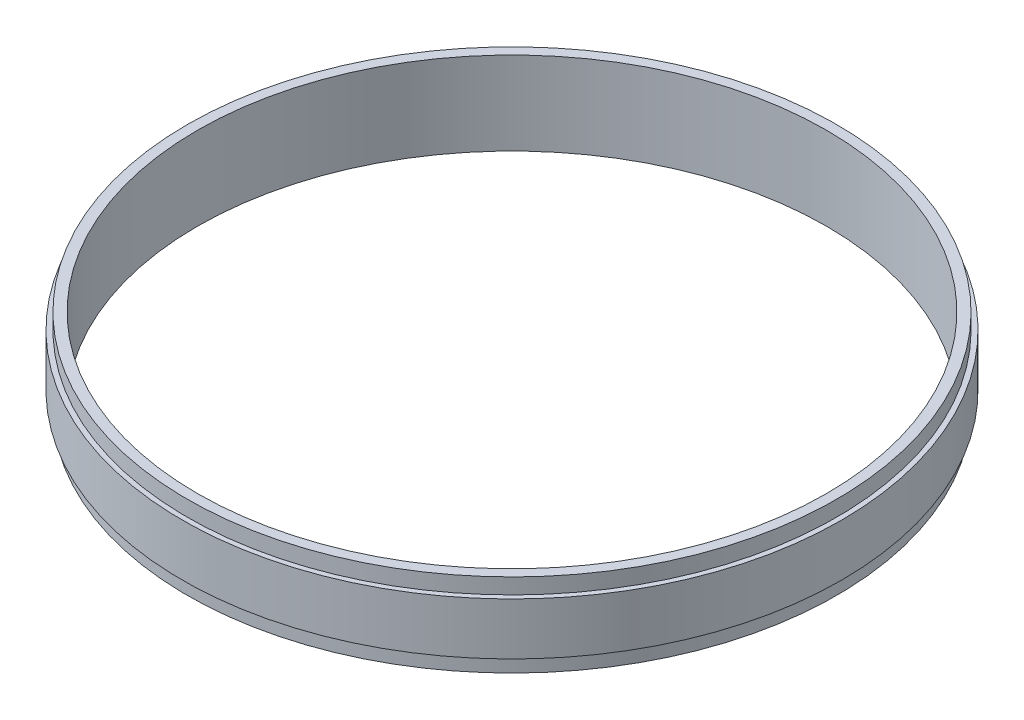
ISO-10303-21;
HEADER;
FILE_DESCRIPTION(('STEP AP214'),'2;1');
FILE_NAME('part.step','',(''),(''),'','','');
FILE_SCHEMA(('AUTOMOTIVE_DESIGN { 1 0 10303 214 1 1 1 1 }'));
ENDSEC;
DATA;
#1=APPLICATION_CONTEXT('core data for automotive mechanical design processes');
#2=APPLICATION_PROTOCOL_DEFINITION('international standard','automotive_design',2000,#1);
#3=PRODUCT_CONTEXT('',#1,'mechanical');
#4=PRODUCT('Part','Part','',(#3));
#5=PRODUCT_RELATED_PRODUCT_CATEGORY('part','',(#4));
#6=PRODUCT_DEFINITION_FORMATION('','',#4);
#7=PRODUCT_DEFINITION_CONTEXT('part definition',#1,'design');
#8=PRODUCT_DEFINITION('design','',#6,#7);
#9=PRODUCT_DEFINITION_SHAPE('','',#8);
#10=(LENGTH_UNIT() NAMED_UNIT(*) SI_UNIT(.MILLI.,.METRE.));
#11=(NAMED_UNIT(*) PLANE_ANGLE_UNIT() SI_UNIT($,.RADIAN.));
#12=(NAMED_UNIT(*) SI_UNIT($,.STERADIAN.) SOLID_ANGLE_UNIT());
#13=UNCERTAINTY_MEASURE_WITH_UNIT(LENGTH_MEASURE(1.E-05),#10,'distance_accuracy_value','');
#14=(GEOMETRIC_REPRESENTATION_CONTEXT(3) GLOBAL_UNCERTAINTY_ASSIGNED_CONTEXT((#13)) GLOBAL_UNIT_ASSIGNED_CONTEXT((#10,
#11,#12)) REPRESENTATION_CONTEXT('',''));
#15=CARTESIAN_POINT('',(0.,0.,0.));
#16=DIRECTION('',(0.,0.,1.));
#17=DIRECTION('',(1.,0.,0.));
#18=AXIS2_PLACEMENT_3D('',#15,#16,#17);
#19=CARTESIAN_POINT('',(0.,-0.8,0.));
#20=DIRECTION('',(0.,1.,0.));
#21=DIRECTION('',(1.,0.,0.));
#22=AXIS2_PLACEMENT_3D('',#19,#20,#21);
#23=CYLINDRICAL_SURFACE('',#22,62.475);
#24=CARTESIAN_POINT('',(0.,3.,0.));
#25=DIRECTION('',(0.,1.,0.));
#26=DIRECTION('',(1.,0.,0.));
#27=AXIS2_PLACEMENT_3D('',#24,#25,#26);
#28=CIRCLE('',#27,62.475);
#29=CARTESIAN_POINT('',(-62.475,3.,0.));
#30=VERTEX_POINT('',#29);
#31=EDGE_CURVE('E21',#30,#30,#28,.T.);
#32=ORIENTED_EDGE('',*,*,#31,.F.);
#33=DIRECTION('',(0.,-1.,0.));
#34=VECTOR('',#33,1.);
#35=CARTESIAN_POINT('',(-62.475,-0.8,0.));
#36=LINE('',#35,#34);
#37=CARTESIAN_POINT('',(-62.475,0.,0.));
#38=VERTEX_POINT('',#37);
#39=EDGE_CURVE('E11',#30,#38,#36,.T.);
#40=ORIENTED_EDGE('',*,*,#39,.T.);
#41=CARTESIAN_POINT('',(0.,0.,0.));
#42=DIRECTION('',(0.,-1.,0.));
#43=DIRECTION('',(1.,0.,0.));
#44=AXIS2_PLACEMENT_3D('',#41,#42,#43);
#45=CIRCLE('',#44,62.475);
#46=EDGE_CURVE('E85',#38,#38,#45,.T.);
#47=ORIENTED_EDGE('',*,*,#46,.F.);
#48=ORIENTED_EDGE('',*,*,#39,.F.);
#49=EDGE_LOOP('',(#32,#40,#47,#48));
#50=FACE_BOUND('',#49,.T.);
#51=ADVANCED_FACE('F17',(#50),#23,.T.);
#52=CARTESIAN_POINT('',(0.,3.,0.));
#53=DIRECTION('',(0.,1.,0.));
#54=DIRECTION('',(1.,0.,0.));
#55=AXIS2_PLACEMENT_3D('',#52,#53,#54);
#56=PLANE('',#55);
#57=ORIENTED_EDGE('',*,*,#31,.T.);
#58=EDGE_LOOP('',(#57));
#59=FACE_BOUND('',#58,.T.);
#60=CARTESIAN_POINT('',(0.,3.,0.));
#61=DIRECTION('',(0.,1.,0.));
#62=DIRECTION('',(1.,0.,0.));
#63=AXIS2_PLACEMENT_3D('',#60,#61,#62);
#64=CIRCLE('',#63,63.4);
#65=CARTESIAN_POINT('',(-63.4,3.,0.));
#66=VERTEX_POINT('',#65);
#67=EDGE_CURVE('E86',#66,#66,#64,.T.);
#68=ORIENTED_EDGE('',*,*,#67,.F.);
#69=EDGE_LOOP('',(#68));
#70=FACE_BOUND('',#69,.T.);
#71=ADVANCED_FACE('F136',(#59,#70),#56,.F.);
#72=CARTESIAN_POINT('',(0.,-0.8,0.));
#73=DIRECTION('',(0.,1.,0.));
#74=DIRECTION('',(1.,0.,0.));
#75=AXIS2_PLACEMENT_3D('',#72,#73,#74);
#76=CYLINDRICAL_SURFACE('',#75,63.4);
#77=CARTESIAN_POINT('',(0.,13.,0.));
#78=DIRECTION('',(0.,1.,0.));
#79=DIRECTION('',(1.,0.,0.));
#80=AXIS2_PLACEMENT_3D('',#77,#78,#79);
#81=CIRCLE('',#80,63.4);
#82=CARTESIAN_POINT('',(-63.4,13.,0.));
#83=VERTEX_POINT('',#82);
#84=EDGE_CURVE('E98',#83,#83,#81,.T.);
#85=ORIENTED_EDGE('',*,*,#84,.F.);
#86=DIRECTION('',(0.,-1.,0.));
#87=VECTOR('',#86,1.);
#88=CARTESIAN_POINT('',(-63.4,-0.8,0.));
#89=LINE('',#88,#87);
#90=EDGE_CURVE('E88',#83,#66,#89,.T.);
#91=ORIENTED_EDGE('',*,*,#90,.T.);
#92=ORIENTED_EDGE('',*,*,#67,.T.);
#93=ORIENTED_EDGE('',*,*,#90,.F.);
#94=EDGE_LOOP('',(#85,#91,#92,#93));
#95=FACE_BOUND('',#94,.T.);
#96=ADVANCED_FACE('F116',(#95),#76,.T.);
#97=CARTESIAN_POINT('',(0.,13.,0.));
#98=DIRECTION('',(0.,1.,0.));
#99=DIRECTION('',(1.,0.,0.));
#100=AXIS2_PLACEMENT_3D('',#97,#98,#99);
#101=PLANE('',#100);
#102=CARTESIAN_POINT('',(0.,13.,0.));
#103=DIRECTION('',(0.,1.,0.));
#104=DIRECTION('',(1.,0.,0.));
#105=AXIS2_PLACEMENT_3D('',#102,#103,#104);
#106=CIRCLE('',#105,62.45);
#107=CARTESIAN_POINT('',(-62.45,13.,0.));
#108=VERTEX_POINT('',#107);
#109=EDGE_CURVE('E95',#108,#108,#106,.T.);
#110=ORIENTED_EDGE('',*,*,#109,.F.);
#111=EDGE_LOOP('',(#110));
#112=FACE_BOUND('',#111,.T.);
#113=ORIENTED_EDGE('',*,*,#84,.T.);
#114=EDGE_LOOP('',(#113));
#115=FACE_BOUND('',#114,.T.);
#116=ADVANCED_FACE('F149',(#112,#115),#101,.T.);
#117=CARTESIAN_POINT('',(0.,-0.8,0.));
#118=DIRECTION('',(0.,1.,0.));
#119=DIRECTION('',(1.,0.,0.));
#120=AXIS2_PLACEMENT_3D('',#117,#118,#119);
#121=CYLINDRICAL_SURFACE('',#120,62.45);
#122=CARTESIAN_POINT('',(0.,16.,0.));
#123=DIRECTION('',(0.,1.,0.));
#124=DIRECTION('',(1.,0.,0.));
#125=AXIS2_PLACEMENT_3D('',#122,#123,#124);
#126=CIRCLE('',#125,62.45);
#127=CARTESIAN_POINT('',(-62.45,16.,0.));
#128=VERTEX_POINT('',#127);
#129=EDGE_CURVE('E69',#128,#128,#126,.T.);
#130=ORIENTED_EDGE('',*,*,#129,.F.);
#131=DIRECTION('',(0.,-1.,0.));
#132=VECTOR('',#131,1.);
#133=CARTESIAN_POINT('',(-62.45,-0.8,0.));
#134=LINE('',#133,#132);
#135=EDGE_CURVE('E77',#128,#108,#134,.T.);
#136=ORIENTED_EDGE('',*,*,#135,.T.);
#137=ORIENTED_EDGE('',*,*,#109,.T.);
#138=ORIENTED_EDGE('',*,*,#135,.F.);
#139=EDGE_LOOP('',(#130,#136,#137,#138));
#140=FACE_BOUND('',#139,.T.);
#141=ADVANCED_FACE('F167',(#140),#121,.T.);
#142=CARTESIAN_POINT('',(0.,16.,0.));
#143=DIRECTION('',(0.,1.,0.));
#144=DIRECTION('',(1.,0.,0.));
#145=AXIS2_PLACEMENT_3D('',#142,#143,#144);
#146=PLANE('',#145);
#147=CARTESIAN_POINT('',(0.,16.,0.));
#148=DIRECTION('',(0.,1.,0.));
#149=DIRECTION('',(1.,0.,0.));
#150=AXIS2_PLACEMENT_3D('',#147,#148,#149);
#151=CIRCLE('',#150,60.525);
#152=CARTESIAN_POINT('',(-60.525,16.,0.));
#153=VERTEX_POINT('',#152);
#154=EDGE_CURVE('E66',#153,#153,#151,.T.);
#155=ORIENTED_EDGE('',*,*,#154,.F.);
#156=EDGE_LOOP('',(#155));
#157=FACE_BOUND('',#156,.T.);
#158=ORIENTED_EDGE('',*,*,#129,.T.);
#159=EDGE_LOOP('',(#158));
#160=FACE_BOUND('',#159,.T.);
#161=ADVANCED_FACE('F131',(#157,#160),#146,.T.);
#162=CARTESIAN_POINT('',(0.,-0.8,0.));
#163=DIRECTION('',(0.,1.,0.));
#164=DIRECTION('',(1.,0.,0.));
#165=AXIS2_PLACEMENT_3D('',#162,#163,#164);
#166=CYLINDRICAL_SURFACE('',#165,60.525);
#167=CARTESIAN_POINT('',(0.,0.,0.));
#168=DIRECTION('',(0.,1.,0.));
#169=DIRECTION('',(1.,0.,0.));
#170=AXIS2_PLACEMENT_3D('',#167,#168,#169);
#171=CIRCLE('',#170,60.525);
#172=CARTESIAN_POINT('',(-60.525,0.,0.));
#173=VERTEX_POINT('',#172);
#174=EDGE_CURVE('E79',#173,#173,#171,.T.);
#175=ORIENTED_EDGE('',*,*,#174,.F.);
#176=DIRECTION('',(0.,1.,0.));
#177=VECTOR('',#176,1.);
#178=CARTESIAN_POINT('',(-60.525,-0.8,0.));
#179=LINE('',#178,#177);
#180=EDGE_CURVE('E61',#173,#153,#179,.T.);
#181=ORIENTED_EDGE('',*,*,#180,.T.);
#182=ORIENTED_EDGE('',*,*,#154,.T.);
#183=ORIENTED_EDGE('',*,*,#180,.F.);
#184=EDGE_LOOP('',(#175,#181,#182,#183));
#185=FACE_BOUND('',#184,.T.);
#186=ADVANCED_FACE('F19',(#185),#166,.F.);
#187=CARTESIAN_POINT('',(0.,0.,0.));
#188=DIRECTION('',(0.,1.,0.));
#189=DIRECTION('',(1.,0.,0.));
#190=AXIS2_PLACEMENT_3D('',#187,#188,#189);
#191=PLANE('',#190);
#192=ORIENTED_EDGE('',*,*,#174,.T.);
#193=EDGE_LOOP('',(#192));
#194=FACE_BOUND('',#193,.T.);
#195=ORIENTED_EDGE('',*,*,#46,.T.);
#196=EDGE_LOOP('',(#195));
#197=FACE_BOUND('',#196,.T.);
#198=ADVANCED_FACE('F130',(#194,#197),#191,.F.);
#199=CLOSED_SHELL('',(#51,#71,#96,#116,#141,#161,#186,#198));
#200=MANIFOLD_SOLID_BREP('B1',#199);
#201=ADVANCED_BREP_SHAPE_REPRESENTATION('',(#18,#200),#14);
#202=SHAPE_DEFINITION_REPRESENTATION(#9,#201);
ENDSEC;
END-ISO-10303-21;
